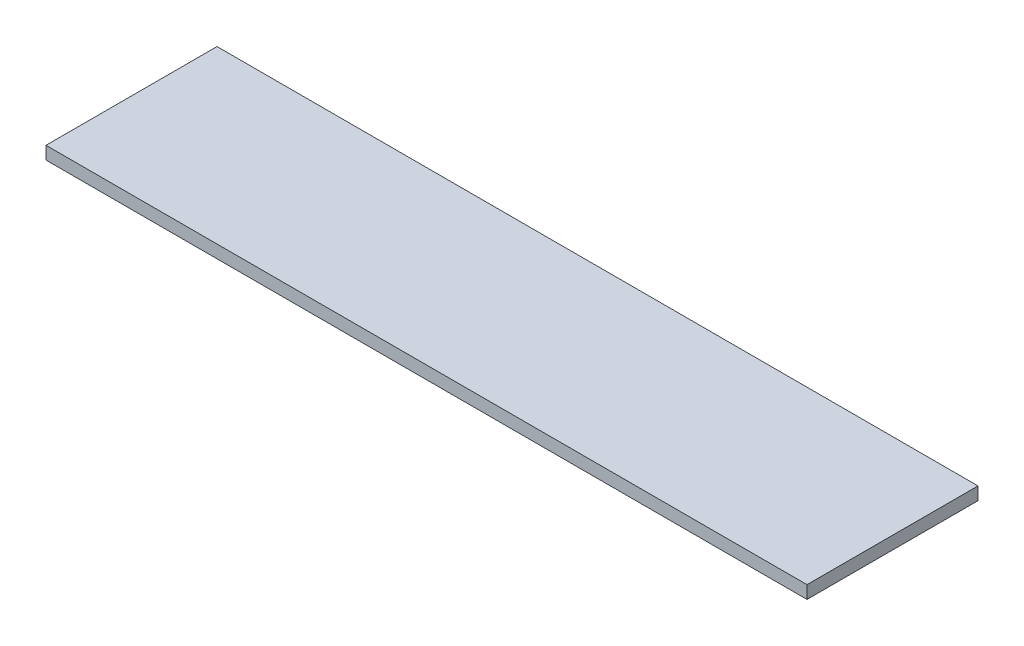
ISO-10303-21;
HEADER;
FILE_DESCRIPTION(('STEP AP214'),'2;1');
FILE_NAME('part.step','',(''),(''),'','','');
FILE_SCHEMA(('AUTOMOTIVE_DESIGN { 1 0 10303 214 1 1 1 1 }'));
ENDSEC;
DATA;
#1=APPLICATION_CONTEXT('core data for automotive mechanical design processes');
#2=APPLICATION_PROTOCOL_DEFINITION('international standard','automotive_design',2000,#1);
#3=PRODUCT_CONTEXT('',#1,'mechanical');
#4=PRODUCT('Part','Part','',(#3));
#5=PRODUCT_RELATED_PRODUCT_CATEGORY('part','',(#4));
#6=PRODUCT_DEFINITION_FORMATION('','',#4);
#7=PRODUCT_DEFINITION_CONTEXT('part definition',#1,'design');
#8=PRODUCT_DEFINITION('design','',#6,#7);
#9=PRODUCT_DEFINITION_SHAPE('','',#8);
#10=(LENGTH_UNIT() NAMED_UNIT(*) SI_UNIT(.MILLI.,.METRE.));
#11=(NAMED_UNIT(*) PLANE_ANGLE_UNIT() SI_UNIT($,.RADIAN.));
#12=(NAMED_UNIT(*) SI_UNIT($,.STERADIAN.) SOLID_ANGLE_UNIT());
#13=UNCERTAINTY_MEASURE_WITH_UNIT(LENGTH_MEASURE(1.E-05),#10,'distance_accuracy_value','');
#14=(GEOMETRIC_REPRESENTATION_CONTEXT(3) GLOBAL_UNCERTAINTY_ASSIGNED_CONTEXT((#13)) GLOBAL_UNIT_ASSIGNED_CONTEXT((#10,
#11,#12)) REPRESENTATION_CONTEXT('',''));
#15=CARTESIAN_POINT('',(0.,0.,0.));
#16=DIRECTION('',(0.,0.,1.));
#17=DIRECTION('',(1.,0.,0.));
#18=AXIS2_PLACEMENT_3D('',#15,#16,#17);
#19=CARTESIAN_POINT('',(44.5,1.5,10.));
#20=DIRECTION('',(-1.,0.,0.));
#21=DIRECTION('',(0.,0.,1.));
#22=AXIS2_PLACEMENT_3D('',#19,#20,#21);
#23=PLANE('',#22);
#24=DIRECTION('',(0.,0.,-1.));
#25=VECTOR('',#24,1.);
#26=CARTESIAN_POINT('',(44.5,0.,10.));
#27=LINE('',#26,#25);
#28=CARTESIAN_POINT('',(44.5,0.,10.));
#29=VERTEX_POINT('',#28);
#30=CARTESIAN_POINT('',(44.5,0.,-10.));
#31=VERTEX_POINT('',#30);
#32=EDGE_CURVE('E96',#29,#31,#27,.T.);
#33=ORIENTED_EDGE('',*,*,#32,.T.);
#34=DIRECTION('',(0.,-1.,0.));
#35=VECTOR('',#34,1.);
#36=CARTESIAN_POINT('',(44.5,1.5,-10.));
#37=LINE('',#36,#35);
#38=CARTESIAN_POINT('',(44.5,1.5,-10.));
#39=VERTEX_POINT('',#38);
#40=EDGE_CURVE('E11',#39,#31,#37,.T.);
#41=ORIENTED_EDGE('',*,*,#40,.F.);
#42=DIRECTION('',(0.,0.,-1.));
#43=VECTOR('',#42,1.);
#44=CARTESIAN_POINT('',(44.5,1.5,10.));
#45=LINE('',#44,#43);
#46=CARTESIAN_POINT('',(44.5,1.5,10.));
#47=VERTEX_POINT('',#46);
#48=EDGE_CURVE('E84',#47,#39,#45,.T.);
#49=ORIENTED_EDGE('',*,*,#48,.F.);
#50=DIRECTION('',(0.,-1.,0.));
#51=VECTOR('',#50,1.);
#52=CARTESIAN_POINT('',(44.5,1.5,10.));
#53=LINE('',#52,#51);
#54=EDGE_CURVE('E92',#47,#29,#53,.T.);
#55=ORIENTED_EDGE('',*,*,#54,.T.);
#56=EDGE_LOOP('',(#33,#41,#49,#55));
#57=FACE_BOUND('',#56,.T.);
#58=ADVANCED_FACE('F33',(#57),#23,.F.);
#59=CARTESIAN_POINT('',(-44.5,1.5,-10.));
#60=DIRECTION('',(0.,0.,1.));
#61=DIRECTION('',(1.,0.,0.));
#62=AXIS2_PLACEMENT_3D('',#59,#60,#61);
#63=PLANE('',#62);
#64=DIRECTION('',(-1.,0.,0.));
#65=VECTOR('',#64,1.);
#66=CARTESIAN_POINT('',(-44.5,0.,-10.));
#67=LINE('',#66,#65);
#68=CARTESIAN_POINT('',(-44.5,0.,-10.));
#69=VERTEX_POINT('',#68);
#70=EDGE_CURVE('E88',#31,#69,#67,.T.);
#71=ORIENTED_EDGE('',*,*,#70,.T.);
#72=DIRECTION('',(0.,-1.,0.));
#73=VECTOR('',#72,1.);
#74=CARTESIAN_POINT('',(-44.5,1.5,-10.));
#75=LINE('',#74,#73);
#76=CARTESIAN_POINT('',(-44.5,1.5,-10.));
#77=VERTEX_POINT('',#76);
#78=EDGE_CURVE('E41',#77,#69,#75,.T.);
#79=ORIENTED_EDGE('',*,*,#78,.F.);
#80=DIRECTION('',(-1.,0.,0.));
#81=VECTOR('',#80,1.);
#82=CARTESIAN_POINT('',(-44.5,1.5,-10.));
#83=LINE('',#82,#81);
#84=EDGE_CURVE('E79',#39,#77,#83,.T.);
#85=ORIENTED_EDGE('',*,*,#84,.F.);
#86=ORIENTED_EDGE('',*,*,#40,.T.);
#87=EDGE_LOOP('',(#71,#79,#85,#86));
#88=FACE_BOUND('',#87,.T.);
#89=ADVANCED_FACE('F87',(#88),#63,.F.);
#90=CARTESIAN_POINT('',(-44.5,1.5,10.));
#91=DIRECTION('',(1.,0.,0.));
#92=DIRECTION('',(0.,0.,-1.));
#93=AXIS2_PLACEMENT_3D('',#90,#91,#92);
#94=PLANE('',#93);
#95=DIRECTION('',(0.,0.,1.));
#96=VECTOR('',#95,1.);
#97=CARTESIAN_POINT('',(-44.5,0.,10.));
#98=LINE('',#97,#96);
#99=CARTESIAN_POINT('',(-44.5,0.,10.));
#100=VERTEX_POINT('',#99);
#101=EDGE_CURVE('E66',#69,#100,#98,.T.);
#102=ORIENTED_EDGE('',*,*,#101,.T.);
#103=DIRECTION('',(0.,-1.,0.));
#104=VECTOR('',#103,1.);
#105=CARTESIAN_POINT('',(-44.5,1.5,10.));
#106=LINE('',#105,#104);
#107=CARTESIAN_POINT('',(-44.5,1.5,10.));
#108=VERTEX_POINT('',#107);
#109=EDGE_CURVE('E89',#108,#100,#106,.T.);
#110=ORIENTED_EDGE('',*,*,#109,.F.);
#111=DIRECTION('',(0.,0.,1.));
#112=VECTOR('',#111,1.);
#113=CARTESIAN_POINT('',(-44.5,1.5,10.));
#114=LINE('',#113,#112);
#115=EDGE_CURVE('E82',#77,#108,#114,.T.);
#116=ORIENTED_EDGE('',*,*,#115,.F.);
#117=ORIENTED_EDGE('',*,*,#78,.T.);
#118=EDGE_LOOP('',(#102,#110,#116,#117));
#119=FACE_BOUND('',#118,.T.);
#120=ADVANCED_FACE('F90',(#119),#94,.F.);
#121=CARTESIAN_POINT('',(-44.5,1.5,10.));
#122=DIRECTION('',(0.,0.,-1.));
#123=DIRECTION('',(-1.,0.,0.));
#124=AXIS2_PLACEMENT_3D('',#121,#122,#123);
#125=PLANE('',#124);
#126=DIRECTION('',(1.,0.,0.));
#127=VECTOR('',#126,1.);
#128=CARTESIAN_POINT('',(-44.5,0.,10.));
#129=LINE('',#128,#127);
#130=EDGE_CURVE('E72',#100,#29,#129,.T.);
#131=ORIENTED_EDGE('',*,*,#130,.T.);
#132=ORIENTED_EDGE('',*,*,#54,.F.);
#133=DIRECTION('',(1.,0.,0.));
#134=VECTOR('',#133,1.);
#135=CARTESIAN_POINT('',(-44.5,1.5,10.));
#136=LINE('',#135,#134);
#137=EDGE_CURVE('E49',#108,#47,#136,.T.);
#138=ORIENTED_EDGE('',*,*,#137,.F.);
#139=ORIENTED_EDGE('',*,*,#109,.T.);
#140=EDGE_LOOP('',(#131,#132,#138,#139));
#141=FACE_BOUND('',#140,.T.);
#142=ADVANCED_FACE('F103',(#141),#125,.F.);
#143=CARTESIAN_POINT('',(0.,1.5,0.));
#144=DIRECTION('',(0.,-1.,0.));
#145=DIRECTION('',(0.,0.,-1.));
#146=AXIS2_PLACEMENT_3D('',#143,#144,#145);
#147=PLANE('',#146);
#148=ORIENTED_EDGE('',*,*,#48,.T.);
#149=ORIENTED_EDGE('',*,*,#84,.T.);
#150=ORIENTED_EDGE('',*,*,#115,.T.);
#151=ORIENTED_EDGE('',*,*,#137,.T.);
#152=EDGE_LOOP('',(#148,#149,#150,#151));
#153=FACE_BOUND('',#152,.T.);
#154=ADVANCED_FACE('F80',(#153),#147,.F.);
#155=CARTESIAN_POINT('',(0.,0.,0.));
#156=DIRECTION('',(0.,-1.,0.));
#157=DIRECTION('',(0.,0.,-1.));
#158=AXIS2_PLACEMENT_3D('',#155,#156,#157);
#159=PLANE('',#158);
#160=ORIENTED_EDGE('',*,*,#32,.F.);
#161=ORIENTED_EDGE('',*,*,#130,.F.);
#162=ORIENTED_EDGE('',*,*,#101,.F.);
#163=ORIENTED_EDGE('',*,*,#70,.F.);
#164=EDGE_LOOP('',(#160,#161,#162,#163));
#165=FACE_BOUND('',#164,.T.);
#166=ADVANCED_FACE('F106',(#165),#159,.T.);
#167=CLOSED_SHELL('',(#58,#89,#120,#142,#154,#166));
#168=MANIFOLD_SOLID_BREP('B2',#167);
#169=ADVANCED_BREP_SHAPE_REPRESENTATION('',(#18,#168),#14);
#170=SHAPE_DEFINITION_REPRESENTATION(#9,#169);
ENDSEC;
END-ISO-10303-21;
